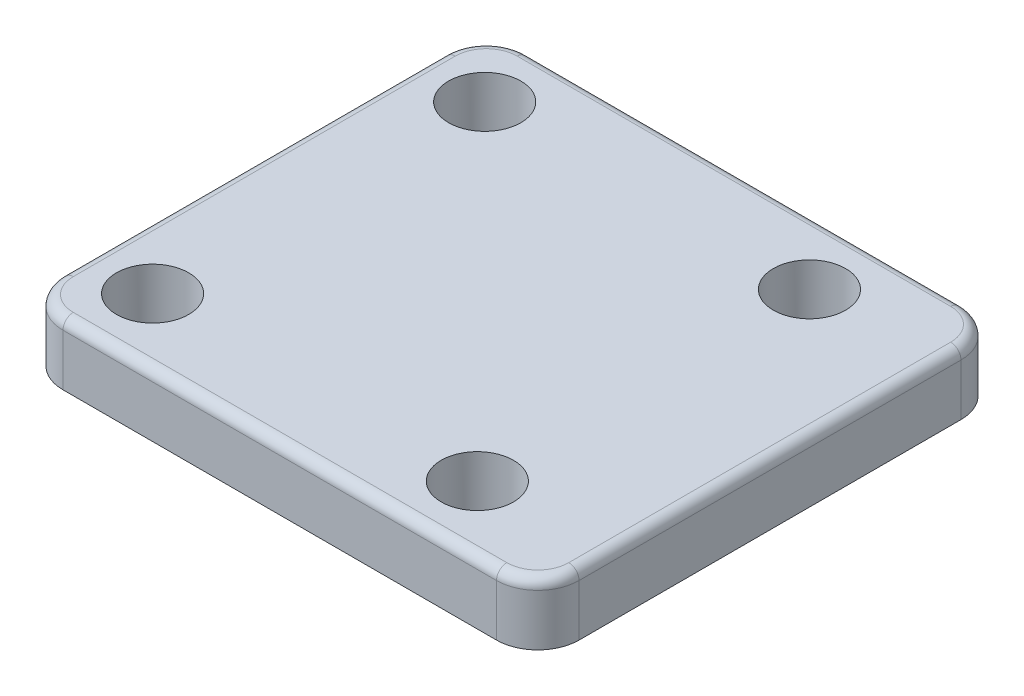
ISO-10303-21;
HEADER;
FILE_DESCRIPTION(('STEP AP214'),'2;1');
FILE_NAME('part.step','',(''),(''),'','','');
FILE_SCHEMA(('AUTOMOTIVE_DESIGN { 1 0 10303 214 1 1 1 1 }'));
ENDSEC;
DATA;
#1=APPLICATION_CONTEXT('core data for automotive mechanical design processes');
#2=APPLICATION_PROTOCOL_DEFINITION('international standard','automotive_design',2000,#1);
#3=PRODUCT_CONTEXT('',#1,'mechanical');
#4=PRODUCT('Part','Part','',(#3));
#5=PRODUCT_RELATED_PRODUCT_CATEGORY('part','',(#4));
#6=PRODUCT_DEFINITION_FORMATION('','',#4);
#7=PRODUCT_DEFINITION_CONTEXT('part definition',#1,'design');
#8=PRODUCT_DEFINITION('design','',#6,#7);
#9=PRODUCT_DEFINITION_SHAPE('','',#8);
#10=(LENGTH_UNIT() NAMED_UNIT(*) SI_UNIT(.MILLI.,.METRE.));
#11=(NAMED_UNIT(*) PLANE_ANGLE_UNIT() SI_UNIT($,.RADIAN.));
#12=(NAMED_UNIT(*) SI_UNIT($,.STERADIAN.) SOLID_ANGLE_UNIT());
#13=UNCERTAINTY_MEASURE_WITH_UNIT(LENGTH_MEASURE(1.E-05),#10,'distance_accuracy_value','');
#14=(GEOMETRIC_REPRESENTATION_CONTEXT(3) GLOBAL_UNCERTAINTY_ASSIGNED_CONTEXT((#13)) GLOBAL_UNIT_ASSIGNED_CONTEXT((#10,
#11,#12)) REPRESENTATION_CONTEXT('',''));
#15=CARTESIAN_POINT('',(0.,0.,0.));
#16=DIRECTION('',(0.,0.,1.));
#17=DIRECTION('',(1.,0.,0.));
#18=AXIS2_PLACEMENT_3D('',#15,#16,#17);
#19=CARTESIAN_POINT('',(-21.,3.,18.5));
#20=DIRECTION('',(0.,-1.,0.));
#21=DIRECTION('',(0.,0.,-1.));
#22=AXIS2_PLACEMENT_3D('',#19,#20,#21);
#23=CYLINDRICAL_SURFACE('',#22,4.);
#24=DIRECTION('',(0.,-1.,0.));
#25=VECTOR('',#24,1.);
#26=CARTESIAN_POINT('',(-21.,3.,22.5));
#27=LINE('',#26,#25);
#28=CARTESIAN_POINT('',(-21.,2.,22.5));
#29=VERTEX_POINT('',#28);
#30=CARTESIAN_POINT('',(-21.,-3.,22.5));
#31=VERTEX_POINT('',#30);
#32=EDGE_CURVE('E131',#29,#31,#27,.T.);
#33=ORIENTED_EDGE('',*,*,#32,.F.);
#34=CARTESIAN_POINT('',(-21.,2.,18.5));
#35=DIRECTION('',(0.,-1.,0.));
#36=DIRECTION('',(0.,0.,-1.));
#37=AXIS2_PLACEMENT_3D('',#34,#35,#36);
#38=CIRCLE('',#37,4.);
#39=CARTESIAN_POINT('',(-25.,2.,18.5));
#40=VERTEX_POINT('',#39);
#41=EDGE_CURVE('E58',#29,#40,#38,.T.);
#42=ORIENTED_EDGE('',*,*,#41,.T.);
#43=DIRECTION('',(0.,-1.,0.));
#44=VECTOR('',#43,1.);
#45=CARTESIAN_POINT('',(-25.,3.,18.5));
#46=LINE('',#45,#44);
#47=CARTESIAN_POINT('',(-25.,-3.,18.5));
#48=VERTEX_POINT('',#47);
#49=EDGE_CURVE('E150',#40,#48,#46,.T.);
#50=ORIENTED_EDGE('',*,*,#49,.T.);
#51=CARTESIAN_POINT('',(-21.,-3.,18.5));
#52=DIRECTION('',(0.,1.,0.));
#53=DIRECTION('',(0.,0.,-1.));
#54=AXIS2_PLACEMENT_3D('',#51,#52,#53);
#55=CIRCLE('',#54,4.);
#56=EDGE_CURVE('E145',#48,#31,#55,.T.);
#57=ORIENTED_EDGE('',*,*,#56,.T.);
#58=EDGE_LOOP('',(#33,#42,#50,#57));
#59=FACE_BOUND('',#58,.T.);
#60=ADVANCED_FACE('F42',(#59),#23,.T.);
#61=CARTESIAN_POINT('',(21.,3.,22.5));
#62=DIRECTION('',(0.,0.,-1.));
#63=DIRECTION('',(-1.,0.,0.));
#64=AXIS2_PLACEMENT_3D('',#61,#62,#63);
#65=PLANE('',#64);
#66=DIRECTION('',(0.,-1.,0.));
#67=VECTOR('',#66,1.);
#68=CARTESIAN_POINT('',(21.,3.,22.5));
#69=LINE('',#68,#67);
#70=CARTESIAN_POINT('',(21.,2.,22.5));
#71=VERTEX_POINT('',#70);
#72=CARTESIAN_POINT('',(21.,-3.,22.5));
#73=VERTEX_POINT('',#72);
#74=EDGE_CURVE('E139',#71,#73,#69,.T.);
#75=ORIENTED_EDGE('',*,*,#74,.F.);
#76=DIRECTION('',(1.,0.,0.));
#77=VECTOR('',#76,1.);
#78=CARTESIAN_POINT('',(21.,2.,22.5));
#79=LINE('',#78,#77);
#80=EDGE_CURVE('E66',#71,#29,#79,.F.);
#81=ORIENTED_EDGE('',*,*,#80,.T.);
#82=ORIENTED_EDGE('',*,*,#32,.T.);
#83=DIRECTION('',(1.,0.,0.));
#84=VECTOR('',#83,1.);
#85=CARTESIAN_POINT('',(21.,-3.,22.5));
#86=LINE('',#85,#84);
#87=EDGE_CURVE('E134',#31,#73,#86,.T.);
#88=ORIENTED_EDGE('',*,*,#87,.T.);
#89=EDGE_LOOP('',(#75,#81,#82,#88));
#90=FACE_BOUND('',#89,.T.);
#91=ADVANCED_FACE('F133',(#90),#65,.F.);
#92=CARTESIAN_POINT('',(21.,3.,18.5));
#93=DIRECTION('',(0.,-1.,0.));
#94=DIRECTION('',(0.,0.,-1.));
#95=AXIS2_PLACEMENT_3D('',#92,#93,#94);
#96=CYLINDRICAL_SURFACE('',#95,4.);
#97=DIRECTION('',(0.,-1.,0.));
#98=VECTOR('',#97,1.);
#99=CARTESIAN_POINT('',(25.,3.,18.5));
#100=LINE('',#99,#98);
#101=CARTESIAN_POINT('',(25.,2.,18.5));
#102=VERTEX_POINT('',#101);
#103=CARTESIAN_POINT('',(25.,-3.,18.5));
#104=VERTEX_POINT('',#103);
#105=EDGE_CURVE('E183',#102,#104,#100,.T.);
#106=ORIENTED_EDGE('',*,*,#105,.F.);
#107=CARTESIAN_POINT('',(21.,2.,18.5));
#108=DIRECTION('',(0.,-1.,0.));
#109=DIRECTION('',(0.,0.,-1.));
#110=AXIS2_PLACEMENT_3D('',#107,#108,#109);
#111=CIRCLE('',#110,4.);
#112=EDGE_CURVE('E211',#102,#71,#111,.T.);
#113=ORIENTED_EDGE('',*,*,#112,.T.);
#114=ORIENTED_EDGE('',*,*,#74,.T.);
#115=CARTESIAN_POINT('',(21.,-3.,18.5));
#116=DIRECTION('',(0.,1.,0.));
#117=DIRECTION('',(0.,0.,1.));
#118=AXIS2_PLACEMENT_3D('',#115,#116,#117);
#119=CIRCLE('',#118,4.);
#120=EDGE_CURVE('E148',#73,#104,#119,.T.);
#121=ORIENTED_EDGE('',*,*,#120,.T.);
#122=EDGE_LOOP('',(#106,#113,#114,#121));
#123=FACE_BOUND('',#122,.T.);
#124=ADVANCED_FACE('F292',(#123),#96,.T.);
#125=CARTESIAN_POINT('',(25.,3.,18.5));
#126=DIRECTION('',(-1.,0.,0.));
#127=DIRECTION('',(0.,0.,1.));
#128=AXIS2_PLACEMENT_3D('',#125,#126,#127);
#129=PLANE('',#128);
#130=DIRECTION('',(0.,-1.,0.));
#131=VECTOR('',#130,1.);
#132=CARTESIAN_POINT('',(25.,3.,-18.5));
#133=LINE('',#132,#131);
#134=CARTESIAN_POINT('',(25.,2.,-18.5));
#135=VERTEX_POINT('',#134);
#136=CARTESIAN_POINT('',(25.,-3.,-18.5));
#137=VERTEX_POINT('',#136);
#138=EDGE_CURVE('E181',#135,#137,#133,.T.);
#139=ORIENTED_EDGE('',*,*,#138,.F.);
#140=DIRECTION('',(0.,0.,-1.));
#141=VECTOR('',#140,1.);
#142=CARTESIAN_POINT('',(25.,2.,18.5));
#143=LINE('',#142,#141);
#144=EDGE_CURVE('E209',#135,#102,#143,.F.);
#145=ORIENTED_EDGE('',*,*,#144,.T.);
#146=ORIENTED_EDGE('',*,*,#105,.T.);
#147=DIRECTION('',(0.,0.,-1.));
#148=VECTOR('',#147,1.);
#149=CARTESIAN_POINT('',(25.,-3.,18.5));
#150=LINE('',#149,#148);
#151=EDGE_CURVE('E160',#104,#137,#150,.T.);
#152=ORIENTED_EDGE('',*,*,#151,.T.);
#153=EDGE_LOOP('',(#139,#145,#146,#152));
#154=FACE_BOUND('',#153,.T.);
#155=ADVANCED_FACE('F366',(#154),#129,.F.);
#156=CARTESIAN_POINT('',(21.,3.,-18.5));
#157=DIRECTION('',(0.,-1.,0.));
#158=DIRECTION('',(0.,0.,-1.));
#159=AXIS2_PLACEMENT_3D('',#156,#157,#158);
#160=CYLINDRICAL_SURFACE('',#159,4.);
#161=DIRECTION('',(0.,-1.,0.));
#162=VECTOR('',#161,1.);
#163=CARTESIAN_POINT('',(21.,3.,-22.5));
#164=LINE('',#163,#162);
#165=CARTESIAN_POINT('',(21.,2.,-22.5));
#166=VERTEX_POINT('',#165);
#167=CARTESIAN_POINT('',(21.,-3.,-22.5));
#168=VERTEX_POINT('',#167);
#169=EDGE_CURVE('E179',#166,#168,#164,.T.);
#170=ORIENTED_EDGE('',*,*,#169,.F.);
#171=CARTESIAN_POINT('',(21.,2.,-18.5));
#172=DIRECTION('',(0.,-1.,0.));
#173=DIRECTION('',(0.,0.,-1.));
#174=AXIS2_PLACEMENT_3D('',#171,#172,#173);
#175=CIRCLE('',#174,4.);
#176=EDGE_CURVE('E207',#166,#135,#175,.T.);
#177=ORIENTED_EDGE('',*,*,#176,.T.);
#178=ORIENTED_EDGE('',*,*,#138,.T.);
#179=CARTESIAN_POINT('',(21.,-3.,-18.5));
#180=DIRECTION('',(0.,1.,0.));
#181=DIRECTION('',(0.,0.,1.));
#182=AXIS2_PLACEMENT_3D('',#179,#180,#181);
#183=CIRCLE('',#182,4.);
#184=EDGE_CURVE('E163',#137,#168,#183,.T.);
#185=ORIENTED_EDGE('',*,*,#184,.T.);
#186=EDGE_LOOP('',(#170,#177,#178,#185));
#187=FACE_BOUND('',#186,.T.);
#188=ADVANCED_FACE('F356',(#187),#160,.T.);
#189=CARTESIAN_POINT('',(21.,3.,-22.5));
#190=DIRECTION('',(0.,0.,1.));
#191=DIRECTION('',(1.,0.,0.));
#192=AXIS2_PLACEMENT_3D('',#189,#190,#191);
#193=PLANE('',#192);
#194=DIRECTION('',(0.,-1.,0.));
#195=VECTOR('',#194,1.);
#196=CARTESIAN_POINT('',(-21.,3.,-22.5));
#197=LINE('',#196,#195);
#198=CARTESIAN_POINT('',(-21.,2.,-22.5));
#199=VERTEX_POINT('',#198);
#200=CARTESIAN_POINT('',(-21.,-3.,-22.5));
#201=VERTEX_POINT('',#200);
#202=EDGE_CURVE('E177',#199,#201,#197,.T.);
#203=ORIENTED_EDGE('',*,*,#202,.F.);
#204=DIRECTION('',(-1.,0.,0.));
#205=VECTOR('',#204,1.);
#206=CARTESIAN_POINT('',(21.,2.,-22.5));
#207=LINE('',#206,#205);
#208=EDGE_CURVE('E205',#199,#166,#207,.F.);
#209=ORIENTED_EDGE('',*,*,#208,.T.);
#210=ORIENTED_EDGE('',*,*,#169,.T.);
#211=DIRECTION('',(-1.,0.,0.));
#212=VECTOR('',#211,1.);
#213=CARTESIAN_POINT('',(21.,-3.,-22.5));
#214=LINE('',#213,#212);
#215=EDGE_CURVE('E166',#168,#201,#214,.T.);
#216=ORIENTED_EDGE('',*,*,#215,.T.);
#217=EDGE_LOOP('',(#203,#209,#210,#216));
#218=FACE_BOUND('',#217,.T.);
#219=ADVANCED_FACE('F353',(#218),#193,.F.);
#220=CARTESIAN_POINT('',(-21.,3.,-18.5));
#221=DIRECTION('',(0.,-1.,0.));
#222=DIRECTION('',(0.,0.,-1.));
#223=AXIS2_PLACEMENT_3D('',#220,#221,#222);
#224=CYLINDRICAL_SURFACE('',#223,4.);
#225=DIRECTION('',(0.,-1.,0.));
#226=VECTOR('',#225,1.);
#227=CARTESIAN_POINT('',(-25.,3.,-18.5));
#228=LINE('',#227,#226);
#229=CARTESIAN_POINT('',(-25.,2.,-18.5));
#230=VERTEX_POINT('',#229);
#231=CARTESIAN_POINT('',(-25.,-3.,-18.5));
#232=VERTEX_POINT('',#231);
#233=EDGE_CURVE('E175',#230,#232,#228,.T.);
#234=ORIENTED_EDGE('',*,*,#233,.F.);
#235=CARTESIAN_POINT('',(-21.,2.,-18.5));
#236=DIRECTION('',(0.,-1.,0.));
#237=DIRECTION('',(0.,0.,-1.));
#238=AXIS2_PLACEMENT_3D('',#235,#236,#237);
#239=CIRCLE('',#238,4.);
#240=EDGE_CURVE('E202',#230,#199,#239,.T.);
#241=ORIENTED_EDGE('',*,*,#240,.T.);
#242=ORIENTED_EDGE('',*,*,#202,.T.);
#243=CARTESIAN_POINT('',(-21.,-3.,-18.5));
#244=DIRECTION('',(0.,1.,0.));
#245=DIRECTION('',(0.,0.,1.));
#246=AXIS2_PLACEMENT_3D('',#243,#244,#245);
#247=CIRCLE('',#246,4.);
#248=EDGE_CURVE('E169',#201,#232,#247,.T.);
#249=ORIENTED_EDGE('',*,*,#248,.T.);
#250=EDGE_LOOP('',(#234,#241,#242,#249));
#251=FACE_BOUND('',#250,.T.);
#252=ADVANCED_FACE('F343',(#251),#224,.T.);
#253=CARTESIAN_POINT('',(-25.,3.,18.5));
#254=DIRECTION('',(1.,0.,0.));
#255=DIRECTION('',(0.,0.,-1.));
#256=AXIS2_PLACEMENT_3D('',#253,#254,#255);
#257=PLANE('',#256);
#258=ORIENTED_EDGE('',*,*,#49,.F.);
#259=DIRECTION('',(0.,0.,1.));
#260=VECTOR('',#259,1.);
#261=CARTESIAN_POINT('',(-25.,2.,18.5));
#262=LINE('',#261,#260);
#263=EDGE_CURVE('E215',#40,#230,#262,.F.);
#264=ORIENTED_EDGE('',*,*,#263,.T.);
#265=ORIENTED_EDGE('',*,*,#233,.T.);
#266=DIRECTION('',(0.,0.,1.));
#267=VECTOR('',#266,1.);
#268=CARTESIAN_POINT('',(-25.,-3.,18.5));
#269=LINE('',#268,#267);
#270=EDGE_CURVE('E172',#232,#48,#269,.T.);
#271=ORIENTED_EDGE('',*,*,#270,.T.);
#272=EDGE_LOOP('',(#258,#264,#265,#271));
#273=FACE_BOUND('',#272,.T.);
#274=ADVANCED_FACE('F340',(#273),#257,.F.);
#275=CARTESIAN_POINT('',(-21.,3.,18.5));
#276=DIRECTION('',(0.,-1.,0.));
#277=DIRECTION('',(0.,0.,-1.));
#278=AXIS2_PLACEMENT_3D('',#275,#276,#277);
#279=PLANE('',#278);
#280=DIRECTION('',(-1.,0.,0.));
#281=VECTOR('',#280,1.);
#282=CARTESIAN_POINT('',(-21.,3.,-21.5));
#283=LINE('',#282,#281);
#284=CARTESIAN_POINT('',(21.,3.,-21.5));
#285=VERTEX_POINT('',#284);
#286=CARTESIAN_POINT('',(-21.,3.,-21.5));
#287=VERTEX_POINT('',#286);
#288=EDGE_CURVE('E197',#285,#287,#283,.T.);
#289=ORIENTED_EDGE('',*,*,#288,.T.);
#290=CARTESIAN_POINT('',(-21.,3.,-18.5));
#291=DIRECTION('',(0.,-1.,0.));
#292=DIRECTION('',(0.,0.,-1.));
#293=AXIS2_PLACEMENT_3D('',#290,#291,#292);
#294=CIRCLE('',#293,3.);
#295=CARTESIAN_POINT('',(-24.,3.,-18.5));
#296=VERTEX_POINT('',#295);
#297=EDGE_CURVE('E199',#287,#296,#294,.F.);
#298=ORIENTED_EDGE('',*,*,#297,.T.);
#299=DIRECTION('',(0.,0.,1.));
#300=VECTOR('',#299,1.);
#301=CARTESIAN_POINT('',(-24.,3.,18.5));
#302=LINE('',#301,#300);
#303=CARTESIAN_POINT('',(-24.,3.,18.5));
#304=VERTEX_POINT('',#303);
#305=EDGE_CURVE('E138',#296,#304,#302,.T.);
#306=ORIENTED_EDGE('',*,*,#305,.T.);
#307=CARTESIAN_POINT('',(-21.,3.,18.5));
#308=DIRECTION('',(0.,-1.,0.));
#309=DIRECTION('',(0.,0.,-1.));
#310=AXIS2_PLACEMENT_3D('',#307,#308,#309);
#311=CIRCLE('',#310,3.);
#312=CARTESIAN_POINT('',(-21.,3.,21.5));
#313=VERTEX_POINT('',#312);
#314=EDGE_CURVE('E187',#304,#313,#311,.F.);
#315=ORIENTED_EDGE('',*,*,#314,.T.);
#316=DIRECTION('',(1.,0.,0.));
#317=VECTOR('',#316,1.);
#318=CARTESIAN_POINT('',(-21.,3.,21.5));
#319=LINE('',#318,#317);
#320=CARTESIAN_POINT('',(21.,3.,21.5));
#321=VERTEX_POINT('',#320);
#322=EDGE_CURVE('E189',#313,#321,#319,.T.);
#323=ORIENTED_EDGE('',*,*,#322,.T.);
#324=CARTESIAN_POINT('',(21.,3.,18.5));
#325=DIRECTION('',(0.,-1.,0.));
#326=DIRECTION('',(0.,0.,-1.));
#327=AXIS2_PLACEMENT_3D('',#324,#325,#326);
#328=CIRCLE('',#327,3.);
#329=CARTESIAN_POINT('',(24.,3.,18.5));
#330=VERTEX_POINT('',#329);
#331=EDGE_CURVE('E191',#321,#330,#328,.F.);
#332=ORIENTED_EDGE('',*,*,#331,.T.);
#333=DIRECTION('',(0.,0.,-1.));
#334=VECTOR('',#333,1.);
#335=CARTESIAN_POINT('',(24.,3.,18.5));
#336=LINE('',#335,#334);
#337=CARTESIAN_POINT('',(24.,3.,-18.5));
#338=VERTEX_POINT('',#337);
#339=EDGE_CURVE('E193',#330,#338,#336,.T.);
#340=ORIENTED_EDGE('',*,*,#339,.T.);
#341=CARTESIAN_POINT('',(21.,3.,-18.5));
#342=DIRECTION('',(0.,-1.,0.));
#343=DIRECTION('',(0.,0.,-1.));
#344=AXIS2_PLACEMENT_3D('',#341,#342,#343);
#345=CIRCLE('',#344,3.);
#346=EDGE_CURVE('E195',#338,#285,#345,.F.);
#347=ORIENTED_EDGE('',*,*,#346,.T.);
#348=EDGE_LOOP('',(#289,#298,#306,#315,#323,#332,#340,#347));
#349=FACE_BOUND('',#348,.T.);
#350=CARTESIAN_POINT('',(12.7301467182873,3.,16.0876500527938));
#351=DIRECTION('',(0.,-1.,0.));
#352=DIRECTION('',(0.,0.,-1.));
#353=AXIS2_PLACEMENT_3D('',#350,#351,#352);
#354=CIRCLE('',#353,3.5);
#355=CARTESIAN_POINT('',(12.7301467182873,3.,12.5876500527938));
#356=VERTEX_POINT('',#355);
#357=EDGE_CURVE('E152',#356,#356,#354,.T.);
#358=ORIENTED_EDGE('',*,*,#357,.T.);
#359=EDGE_LOOP('',(#358));
#360=FACE_BOUND('',#359,.T.);
#361=CARTESIAN_POINT('',(12.7301467182873,3.,-16.0876500527938));
#362=DIRECTION('',(0.,-1.,0.));
#363=DIRECTION('',(0.,0.,-1.));
#364=AXIS2_PLACEMENT_3D('',#361,#362,#363);
#365=CIRCLE('',#364,3.5);
#366=CARTESIAN_POINT('',(12.7301467182873,3.,-19.5876500527938));
#367=VERTEX_POINT('',#366);
#368=EDGE_CURVE('E155',#367,#367,#365,.T.);
#369=ORIENTED_EDGE('',*,*,#368,.T.);
#370=EDGE_LOOP('',(#369));
#371=FACE_BOUND('',#370,.T.);
#372=CARTESIAN_POINT('',(-18.7301467182873,3.,-16.0876500527938));
#373=DIRECTION('',(0.,-1.,0.));
#374=DIRECTION('',(0.,0.,-1.));
#375=AXIS2_PLACEMENT_3D('',#372,#373,#374);
#376=CIRCLE('',#375,3.5);
#377=CARTESIAN_POINT('',(-18.7301467182873,3.,-19.5876500527938));
#378=VERTEX_POINT('',#377);
#379=EDGE_CURVE('E262',#378,#378,#376,.T.);
#380=ORIENTED_EDGE('',*,*,#379,.T.);
#381=EDGE_LOOP('',(#380));
#382=FACE_BOUND('',#381,.T.);
#383=CARTESIAN_POINT('',(-18.7301467182873,3.,16.0876500527938));
#384=DIRECTION('',(0.,-1.,0.));
#385=DIRECTION('',(0.,0.,-1.));
#386=AXIS2_PLACEMENT_3D('',#383,#384,#385);
#387=CIRCLE('',#386,3.5);
#388=CARTESIAN_POINT('',(-18.7301467182873,3.,12.5876500527938));
#389=VERTEX_POINT('',#388);
#390=EDGE_CURVE('E259',#389,#389,#387,.T.);
#391=ORIENTED_EDGE('',*,*,#390,.T.);
#392=EDGE_LOOP('',(#391));
#393=FACE_BOUND('',#392,.T.);
#394=ADVANCED_FACE('F267',(#349,#360,#371,#382,#393),#279,.F.);
#395=CARTESIAN_POINT('',(-21.,-3.,18.5));
#396=DIRECTION('',(0.,-1.,0.));
#397=DIRECTION('',(0.,0.,-1.));
#398=AXIS2_PLACEMENT_3D('',#395,#396,#397);
#399=PLANE('',#398);
#400=CARTESIAN_POINT('',(0.,-3.,0.));
#401=DIRECTION('',(0.,-1.,0.));
#402=DIRECTION('',(0.,0.,-1.));
#403=AXIS2_PLACEMENT_3D('',#400,#401,#402);
#404=CIRCLE('',#403,16.);
#405=CARTESIAN_POINT('',(0.,-3.,-16.));
#406=VERTEX_POINT('',#405);
#407=EDGE_CURVE('E217',#406,#406,#404,.T.);
#408=ORIENTED_EDGE('',*,*,#407,.F.);
#409=EDGE_LOOP('',(#408));
#410=FACE_BOUND('',#409,.T.);
#411=CARTESIAN_POINT('',(12.7301467182873,-3.,16.0876500527938));
#412=DIRECTION('',(0.,1.,0.));
#413=DIRECTION('',(0.,0.,1.));
#414=AXIS2_PLACEMENT_3D('',#411,#412,#413);
#415=CIRCLE('',#414,3.5);
#416=CARTESIAN_POINT('',(12.7301467182873,-3.,19.5876500527938));
#417=VERTEX_POINT('',#416);
#418=EDGE_CURVE('E239',#417,#417,#415,.T.);
#419=ORIENTED_EDGE('',*,*,#418,.T.);
#420=EDGE_LOOP('',(#419));
#421=FACE_BOUND('',#420,.T.);
#422=CARTESIAN_POINT('',(12.7301467182873,-3.,-16.0876500527938));
#423=DIRECTION('',(0.,1.,0.));
#424=DIRECTION('',(0.,0.,1.));
#425=AXIS2_PLACEMENT_3D('',#422,#423,#424);
#426=CIRCLE('',#425,3.5);
#427=CARTESIAN_POINT('',(12.7301467182873,-3.,-12.5876500527938));
#428=VERTEX_POINT('',#427);
#429=EDGE_CURVE('E252',#428,#428,#426,.T.);
#430=ORIENTED_EDGE('',*,*,#429,.T.);
#431=EDGE_LOOP('',(#430));
#432=FACE_BOUND('',#431,.T.);
#433=CARTESIAN_POINT('',(-18.7301467182873,-3.,-16.0876500527938));
#434=DIRECTION('',(0.,1.,0.));
#435=DIRECTION('',(0.,0.,1.));
#436=AXIS2_PLACEMENT_3D('',#433,#434,#435);
#437=CIRCLE('',#436,3.5);
#438=CARTESIAN_POINT('',(-18.7301467182873,-3.,-12.5876500527938));
#439=VERTEX_POINT('',#438);
#440=EDGE_CURVE('E248',#439,#439,#437,.T.);
#441=ORIENTED_EDGE('',*,*,#440,.T.);
#442=EDGE_LOOP('',(#441));
#443=FACE_BOUND('',#442,.T.);
#444=CARTESIAN_POINT('',(-18.7301467182873,-3.,16.0876500527938));
#445=DIRECTION('',(0.,1.,0.));
#446=DIRECTION('',(0.,0.,1.));
#447=AXIS2_PLACEMENT_3D('',#444,#445,#446);
#448=CIRCLE('',#447,3.5);
#449=CARTESIAN_POINT('',(-18.7301467182873,-3.,19.5876500527938));
#450=VERTEX_POINT('',#449);
#451=EDGE_CURVE('E251',#450,#450,#448,.T.);
#452=ORIENTED_EDGE('',*,*,#451,.T.);
#453=EDGE_LOOP('',(#452));
#454=FACE_BOUND('',#453,.T.);
#455=ORIENTED_EDGE('',*,*,#56,.F.);
#456=ORIENTED_EDGE('',*,*,#270,.F.);
#457=ORIENTED_EDGE('',*,*,#248,.F.);
#458=ORIENTED_EDGE('',*,*,#215,.F.);
#459=ORIENTED_EDGE('',*,*,#184,.F.);
#460=ORIENTED_EDGE('',*,*,#151,.F.);
#461=ORIENTED_EDGE('',*,*,#120,.F.);
#462=ORIENTED_EDGE('',*,*,#87,.F.);
#463=EDGE_LOOP('',(#455,#456,#457,#458,#459,#460,#461,#462));
#464=FACE_BOUND('',#463,.T.);
#465=ADVANCED_FACE('F143',(#410,#421,#432,#443,#454,#464),#399,.T.);
#466=CARTESIAN_POINT('',(-18.7301467182873,-3.,16.0876500527938));
#467=DIRECTION('',(0.,1.,0.));
#468=DIRECTION('',(0.,0.,1.));
#469=AXIS2_PLACEMENT_3D('',#466,#467,#468);
#470=CYLINDRICAL_SURFACE('',#469,3.5);
#471=ORIENTED_EDGE('',*,*,#451,.F.);
#472=EDGE_LOOP('',(#471));
#473=FACE_BOUND('',#472,.T.);
#474=ORIENTED_EDGE('',*,*,#390,.F.);
#475=EDGE_LOOP('',(#474));
#476=FACE_BOUND('',#475,.T.);
#477=ADVANCED_FACE('F283',(#473,#476),#470,.F.);
#478=CARTESIAN_POINT('',(-18.7301467182873,-3.,-16.0876500527938));
#479=DIRECTION('',(0.,1.,0.));
#480=DIRECTION('',(0.,0.,1.));
#481=AXIS2_PLACEMENT_3D('',#478,#479,#480);
#482=CYLINDRICAL_SURFACE('',#481,3.5);
#483=ORIENTED_EDGE('',*,*,#440,.F.);
#484=EDGE_LOOP('',(#483));
#485=FACE_BOUND('',#484,.T.);
#486=ORIENTED_EDGE('',*,*,#379,.F.);
#487=EDGE_LOOP('',(#486));
#488=FACE_BOUND('',#487,.T.);
#489=ADVANCED_FACE('F273',(#485,#488),#482,.F.);
#490=CARTESIAN_POINT('',(12.7301467182873,-3.,-16.0876500527938));
#491=DIRECTION('',(0.,1.,0.));
#492=DIRECTION('',(0.,0.,1.));
#493=AXIS2_PLACEMENT_3D('',#490,#491,#492);
#494=CYLINDRICAL_SURFACE('',#493,3.5);
#495=ORIENTED_EDGE('',*,*,#429,.F.);
#496=EDGE_LOOP('',(#495));
#497=FACE_BOUND('',#496,.T.);
#498=ORIENTED_EDGE('',*,*,#368,.F.);
#499=EDGE_LOOP('',(#498));
#500=FACE_BOUND('',#499,.T.);
#501=ADVANCED_FACE('F270',(#497,#500),#494,.F.);
#502=CARTESIAN_POINT('',(12.7301467182873,-3.,16.0876500527938));
#503=DIRECTION('',(0.,1.,0.));
#504=DIRECTION('',(0.,0.,1.));
#505=AXIS2_PLACEMENT_3D('',#502,#503,#504);
#506=CYLINDRICAL_SURFACE('',#505,3.5);
#507=ORIENTED_EDGE('',*,*,#418,.F.);
#508=EDGE_LOOP('',(#507));
#509=FACE_BOUND('',#508,.T.);
#510=ORIENTED_EDGE('',*,*,#357,.F.);
#511=EDGE_LOOP('',(#510));
#512=FACE_BOUND('',#511,.T.);
#513=ADVANCED_FACE('F272',(#509,#512),#506,.F.);
#514=CARTESIAN_POINT('',(21.,2.,18.5));
#515=DIRECTION('',(0.,-1.,0.));
#516=DIRECTION('',(0.,0.,-1.));
#517=AXIS2_PLACEMENT_3D('',#514,#515,#516);
#518=TOROIDAL_SURFACE('',#517,3.,1.);
#519=CARTESIAN_POINT('',(21.,2.,21.5));
#520=DIRECTION('',(-1.,0.,0.));
#521=DIRECTION('',(0.,0.,1.));
#522=AXIS2_PLACEMENT_3D('',#519,#520,#521);
#523=CIRCLE('',#522,1.);
#524=EDGE_CURVE('E234',#71,#321,#523,.T.);
#525=ORIENTED_EDGE('',*,*,#524,.F.);
#526=ORIENTED_EDGE('',*,*,#112,.F.);
#527=CARTESIAN_POINT('',(24.,2.,18.5));
#528=DIRECTION('',(0.,0.,-1.));
#529=DIRECTION('',(-1.,0.,0.));
#530=AXIS2_PLACEMENT_3D('',#527,#528,#529);
#531=CIRCLE('',#530,1.);
#532=EDGE_CURVE('E237',#330,#102,#531,.T.);
#533=ORIENTED_EDGE('',*,*,#532,.F.);
#534=ORIENTED_EDGE('',*,*,#331,.F.);
#535=EDGE_LOOP('',(#525,#526,#533,#534));
#536=FACE_BOUND('',#535,.T.);
#537=ADVANCED_FACE('F280',(#536),#518,.T.);
#538=CARTESIAN_POINT('',(24.,2.,18.5));
#539=DIRECTION('',(0.,0.,-1.));
#540=DIRECTION('',(-1.,0.,0.));
#541=AXIS2_PLACEMENT_3D('',#538,#539,#540);
#542=CYLINDRICAL_SURFACE('',#541,1.);
#543=ORIENTED_EDGE('',*,*,#532,.T.);
#544=ORIENTED_EDGE('',*,*,#144,.F.);
#545=CARTESIAN_POINT('',(24.,2.,-18.5));
#546=DIRECTION('',(0.,0.,-1.));
#547=DIRECTION('',(-1.,0.,0.));
#548=AXIS2_PLACEMENT_3D('',#545,#546,#547);
#549=CIRCLE('',#548,1.);
#550=EDGE_CURVE('E231',#338,#135,#549,.T.);
#551=ORIENTED_EDGE('',*,*,#550,.F.);
#552=ORIENTED_EDGE('',*,*,#339,.F.);
#553=EDGE_LOOP('',(#543,#544,#551,#552));
#554=FACE_BOUND('',#553,.T.);
#555=ADVANCED_FACE('F320',(#554),#542,.T.);
#556=CARTESIAN_POINT('',(-21.,2.,21.5));
#557=DIRECTION('',(1.,0.,0.));
#558=DIRECTION('',(0.,0.,-1.));
#559=AXIS2_PLACEMENT_3D('',#556,#557,#558);
#560=CYLINDRICAL_SURFACE('',#559,1.);
#561=ORIENTED_EDGE('',*,*,#524,.T.);
#562=ORIENTED_EDGE('',*,*,#322,.F.);
#563=CARTESIAN_POINT('',(-21.,2.,21.5));
#564=DIRECTION('',(-1.,0.,0.));
#565=DIRECTION('',(0.,0.,1.));
#566=AXIS2_PLACEMENT_3D('',#563,#564,#565);
#567=CIRCLE('',#566,1.);
#568=EDGE_CURVE('E228',#29,#313,#567,.T.);
#569=ORIENTED_EDGE('',*,*,#568,.F.);
#570=ORIENTED_EDGE('',*,*,#80,.F.);
#571=EDGE_LOOP('',(#561,#562,#569,#570));
#572=FACE_BOUND('',#571,.T.);
#573=ADVANCED_FACE('F316',(#572),#560,.T.);
#574=CARTESIAN_POINT('',(21.,2.,-18.5));
#575=DIRECTION('',(0.,-1.,0.));
#576=DIRECTION('',(0.,0.,-1.));
#577=AXIS2_PLACEMENT_3D('',#574,#575,#576);
#578=TOROIDAL_SURFACE('',#577,3.,1.);
#579=ORIENTED_EDGE('',*,*,#550,.T.);
#580=ORIENTED_EDGE('',*,*,#176,.F.);
#581=CARTESIAN_POINT('',(21.,2.,-21.5));
#582=DIRECTION('',(-1.,0.,0.));
#583=DIRECTION('',(0.,0.,1.));
#584=AXIS2_PLACEMENT_3D('',#581,#582,#583);
#585=CIRCLE('',#584,1.);
#586=EDGE_CURVE('E225',#285,#166,#585,.T.);
#587=ORIENTED_EDGE('',*,*,#586,.F.);
#588=ORIENTED_EDGE('',*,*,#346,.F.);
#589=EDGE_LOOP('',(#579,#580,#587,#588));
#590=FACE_BOUND('',#589,.T.);
#591=ADVANCED_FACE('F312',(#590),#578,.T.);
#592=CARTESIAN_POINT('',(-21.,2.,18.5));
#593=DIRECTION('',(0.,-1.,0.));
#594=DIRECTION('',(0.,0.,-1.));
#595=AXIS2_PLACEMENT_3D('',#592,#593,#594);
#596=TOROIDAL_SURFACE('',#595,3.,1.);
#597=ORIENTED_EDGE('',*,*,#568,.T.);
#598=ORIENTED_EDGE('',*,*,#314,.F.);
#599=CARTESIAN_POINT('',(-24.,2.,18.5));
#600=DIRECTION('',(0.,0.,-1.));
#601=DIRECTION('',(-1.,0.,0.));
#602=AXIS2_PLACEMENT_3D('',#599,#600,#601);
#603=CIRCLE('',#602,1.);
#604=EDGE_CURVE('E222',#40,#304,#603,.T.);
#605=ORIENTED_EDGE('',*,*,#604,.F.);
#606=ORIENTED_EDGE('',*,*,#41,.F.);
#607=EDGE_LOOP('',(#597,#598,#605,#606));
#608=FACE_BOUND('',#607,.T.);
#609=ADVANCED_FACE('F308',(#608),#596,.T.);
#610=CARTESIAN_POINT('',(-21.,2.,-21.5));
#611=DIRECTION('',(-1.,0.,0.));
#612=DIRECTION('',(0.,0.,1.));
#613=AXIS2_PLACEMENT_3D('',#610,#611,#612);
#614=CYLINDRICAL_SURFACE('',#613,1.);
#615=ORIENTED_EDGE('',*,*,#586,.T.);
#616=ORIENTED_EDGE('',*,*,#208,.F.);
#617=CARTESIAN_POINT('',(-21.,2.,-21.5));
#618=DIRECTION('',(-1.,0.,0.));
#619=DIRECTION('',(0.,0.,1.));
#620=AXIS2_PLACEMENT_3D('',#617,#618,#619);
#621=CIRCLE('',#620,1.);
#622=EDGE_CURVE('E220',#287,#199,#621,.T.);
#623=ORIENTED_EDGE('',*,*,#622,.F.);
#624=ORIENTED_EDGE('',*,*,#288,.F.);
#625=EDGE_LOOP('',(#615,#616,#623,#624));
#626=FACE_BOUND('',#625,.T.);
#627=ADVANCED_FACE('F304',(#626),#614,.T.);
#628=CARTESIAN_POINT('',(-24.,2.,18.5));
#629=DIRECTION('',(0.,0.,1.));
#630=DIRECTION('',(1.,0.,0.));
#631=AXIS2_PLACEMENT_3D('',#628,#629,#630);
#632=CYLINDRICAL_SURFACE('',#631,1.);
#633=ORIENTED_EDGE('',*,*,#604,.T.);
#634=ORIENTED_EDGE('',*,*,#305,.F.);
#635=CARTESIAN_POINT('',(-24.,2.,-18.5));
#636=DIRECTION('',(0.,0.,-1.));
#637=DIRECTION('',(0.,1.,0.));
#638=AXIS2_PLACEMENT_3D('',#635,#636,#637);
#639=CIRCLE('',#638,1.);
#640=EDGE_CURVE('E218',#230,#296,#639,.T.);
#641=ORIENTED_EDGE('',*,*,#640,.F.);
#642=ORIENTED_EDGE('',*,*,#263,.F.);
#643=EDGE_LOOP('',(#633,#634,#641,#642));
#644=FACE_BOUND('',#643,.T.);
#645=ADVANCED_FACE('F300',(#644),#632,.T.);
#646=CARTESIAN_POINT('',(-21.,2.,-18.5));
#647=DIRECTION('',(0.,-1.,0.));
#648=DIRECTION('',(0.,0.,-1.));
#649=AXIS2_PLACEMENT_3D('',#646,#647,#648);
#650=TOROIDAL_SURFACE('',#649,3.,1.);
#651=ORIENTED_EDGE('',*,*,#622,.T.);
#652=ORIENTED_EDGE('',*,*,#240,.F.);
#653=ORIENTED_EDGE('',*,*,#640,.T.);
#654=ORIENTED_EDGE('',*,*,#297,.F.);
#655=EDGE_LOOP('',(#651,#652,#653,#654));
#656=FACE_BOUND('',#655,.T.);
#657=ADVANCED_FACE('F296',(#656),#650,.T.);
#658=CARTESIAN_POINT('',(0.,-5.,0.));
#659=DIRECTION('',(0.,1.,0.));
#660=DIRECTION('',(0.,0.,1.));
#661=AXIS2_PLACEMENT_3D('',#658,#659,#660);
#662=CYLINDRICAL_SURFACE('',#661,16.);
#663=CARTESIAN_POINT('',(0.,-4.,0.));
#664=DIRECTION('',(0.,-1.,0.));
#665=DIRECTION('',(0.,0.,-1.));
#666=AXIS2_PLACEMENT_3D('',#663,#664,#665);
#667=CIRCLE('',#666,16.);
#668=CARTESIAN_POINT('',(0.,-4.,-16.));
#669=VERTEX_POINT('',#668);
#670=EDGE_CURVE('E11',#669,#669,#667,.F.);
#671=ORIENTED_EDGE('',*,*,#670,.T.);
#672=EDGE_LOOP('',(#671));
#673=FACE_BOUND('',#672,.T.);
#674=ORIENTED_EDGE('',*,*,#407,.T.);
#675=EDGE_LOOP('',(#674));
#676=FACE_BOUND('',#675,.T.);
#677=ADVANCED_FACE('F299',(#673,#676),#662,.T.);
#678=CARTESIAN_POINT('',(0.,-5.,0.));
#679=DIRECTION('',(0.,-1.,0.));
#680=DIRECTION('',(0.,0.,-1.));
#681=AXIS2_PLACEMENT_3D('',#678,#679,#680);
#682=PLANE('',#681);
#683=CARTESIAN_POINT('',(0.,-5.,0.));
#684=DIRECTION('',(0.,-1.,0.));
#685=DIRECTION('',(0.,0.,-1.));
#686=AXIS2_PLACEMENT_3D('',#683,#684,#685);
#687=CIRCLE('',#686,15.);
#688=CARTESIAN_POINT('',(0.,-5.,-15.));
#689=VERTEX_POINT('',#688);
#690=EDGE_CURVE('E51',#689,#689,#687,.T.);
#691=ORIENTED_EDGE('',*,*,#690,.T.);
#692=EDGE_LOOP('',(#691));
#693=FACE_BOUND('',#692,.T.);
#694=ADVANCED_FACE('F523',(#693),#682,.T.);
#695=CARTESIAN_POINT('',(0.,-5.,0.));
#696=DIRECTION('',(0.,1.,0.));
#697=DIRECTION('',(0.,0.,1.));
#698=AXIS2_PLACEMENT_3D('',#695,#696,#697);
#699=CONICAL_SURFACE('',#698,15.,0.785398163397448);
#700=ORIENTED_EDGE('',*,*,#670,.F.);
#701=EDGE_LOOP('',(#700));
#702=FACE_BOUND('',#701,.T.);
#703=ORIENTED_EDGE('',*,*,#690,.F.);
#704=EDGE_LOOP('',(#703));
#705=FACE_BOUND('',#704,.T.);
#706=ADVANCED_FACE('F45',(#702,#705),#699,.T.);
#707=CLOSED_SHELL('',(#60,#91,#124,#155,#188,#219,#252,#274,#394,#465,#477,#489,#501,#513,#537,
#555,#573,#591,#609,#627,#645,#657,#677,#694,#706));
#708=MANIFOLD_SOLID_BREP('B2',#707);
#709=ADVANCED_BREP_SHAPE_REPRESENTATION('',(#18,#708),#14);
#710=SHAPE_DEFINITION_REPRESENTATION(#9,#709);
ENDSEC;
END-ISO-10303-21;
